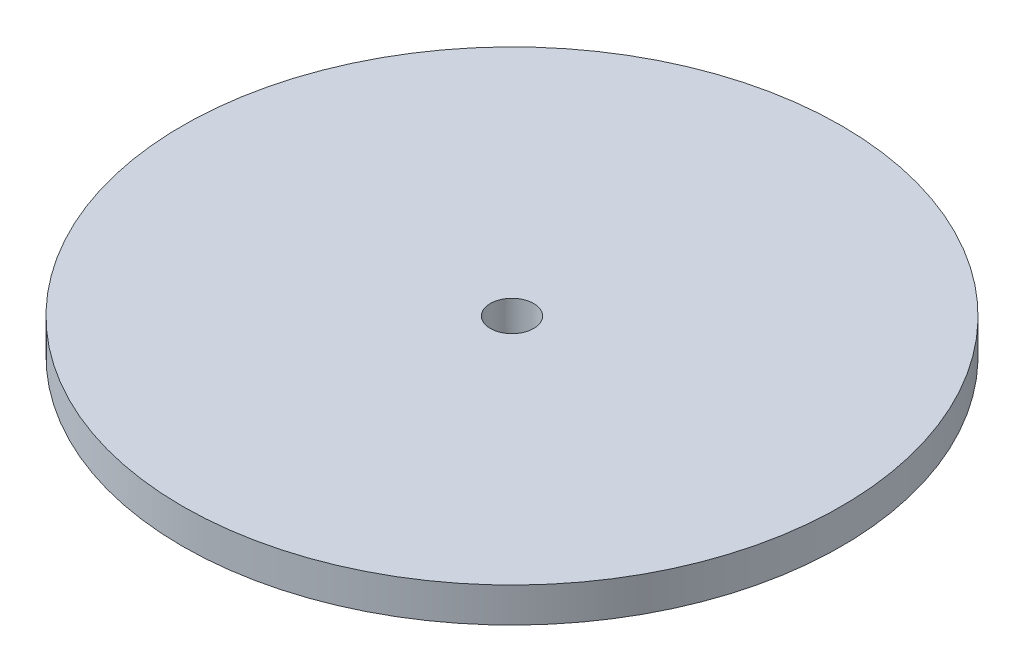
ISO-10303-21;
HEADER;
FILE_DESCRIPTION(('STEP AP214'),'2;1');
FILE_NAME('part.step','',(''),(''),'','','');
FILE_SCHEMA(('AUTOMOTIVE_DESIGN { 1 0 10303 214 1 1 1 1 }'));
ENDSEC;
DATA;
#1=APPLICATION_CONTEXT('core data for automotive mechanical design processes');
#2=APPLICATION_PROTOCOL_DEFINITION('international standard','automotive_design',2000,#1);
#3=PRODUCT_CONTEXT('',#1,'mechanical');
#4=PRODUCT('Part','Part','',(#3));
#5=PRODUCT_RELATED_PRODUCT_CATEGORY('part','',(#4));
#6=PRODUCT_DEFINITION_FORMATION('','',#4);
#7=PRODUCT_DEFINITION_CONTEXT('part definition',#1,'design');
#8=PRODUCT_DEFINITION('design','',#6,#7);
#9=PRODUCT_DEFINITION_SHAPE('','',#8);
#10=(LENGTH_UNIT() NAMED_UNIT(*) SI_UNIT(.MILLI.,.METRE.));
#11=(NAMED_UNIT(*) PLANE_ANGLE_UNIT() SI_UNIT($,.RADIAN.));
#12=(NAMED_UNIT(*) SI_UNIT($,.STERADIAN.) SOLID_ANGLE_UNIT());
#13=UNCERTAINTY_MEASURE_WITH_UNIT(LENGTH_MEASURE(1.E-05),#10,'distance_accuracy_value','');
#14=(GEOMETRIC_REPRESENTATION_CONTEXT(3) GLOBAL_UNCERTAINTY_ASSIGNED_CONTEXT((#13)) GLOBAL_UNIT_ASSIGNED_CONTEXT((#10,
#11,#12)) REPRESENTATION_CONTEXT('',''));
#15=CARTESIAN_POINT('',(0.,0.,0.));
#16=DIRECTION('',(0.,0.,1.));
#17=DIRECTION('',(1.,0.,0.));
#18=AXIS2_PLACEMENT_3D('',#15,#16,#17);
#19=CARTESIAN_POINT('',(0.,4.,0.));
#20=DIRECTION('',(0.,1.,0.));
#21=DIRECTION('',(0.,0.,1.));
#22=AXIS2_PLACEMENT_3D('',#19,#20,#21);
#23=PLANE('',#22);
#24=CARTESIAN_POINT('',(0.,4.,0.));
#25=DIRECTION('',(0.,1.,0.));
#26=DIRECTION('',(0.,0.,1.));
#27=AXIS2_PLACEMENT_3D('',#24,#25,#26);
#28=CIRCLE('',#27,38.);
#29=CARTESIAN_POINT('',(0.,4.,38.));
#30=VERTEX_POINT('',#29);
#31=EDGE_CURVE('E10',#30,#30,#28,.T.);
#32=ORIENTED_EDGE('',*,*,#31,.T.);
#33=EDGE_LOOP('',(#32));
#34=FACE_BOUND('',#33,.T.);
#35=CARTESIAN_POINT('',(0.,4.,0.));
#36=DIRECTION('',(0.,1.,0.));
#37=DIRECTION('',(0.,0.,1.));
#38=AXIS2_PLACEMENT_3D('',#35,#36,#37);
#39=CIRCLE('',#38,2.5);
#40=CARTESIAN_POINT('',(0.,4.,2.5));
#41=VERTEX_POINT('',#40);
#42=EDGE_CURVE('E43',#41,#41,#39,.T.);
#43=ORIENTED_EDGE('',*,*,#42,.F.);
#44=EDGE_LOOP('',(#43));
#45=FACE_BOUND('',#44,.T.);
#46=ADVANCED_FACE('F32',(#34,#45),#23,.T.);
#47=CARTESIAN_POINT('',(0.,0.,0.));
#48=DIRECTION('',(0.,1.,0.));
#49=DIRECTION('',(0.,0.,1.));
#50=AXIS2_PLACEMENT_3D('',#47,#48,#49);
#51=PLANE('',#50);
#52=CARTESIAN_POINT('',(0.,0.,0.));
#53=DIRECTION('',(0.,1.,0.));
#54=DIRECTION('',(0.,0.,1.));
#55=AXIS2_PLACEMENT_3D('',#52,#53,#54);
#56=CIRCLE('',#55,38.);
#57=CARTESIAN_POINT('',(0.,0.,38.));
#58=VERTEX_POINT('',#57);
#59=EDGE_CURVE('E36',#58,#58,#56,.T.);
#60=ORIENTED_EDGE('',*,*,#59,.F.);
#61=EDGE_LOOP('',(#60));
#62=FACE_BOUND('',#61,.T.);
#63=CARTESIAN_POINT('',(0.,0.,0.));
#64=DIRECTION('',(0.,1.,0.));
#65=DIRECTION('',(0.,0.,1.));
#66=AXIS2_PLACEMENT_3D('',#63,#64,#65);
#67=CIRCLE('',#66,2.5);
#68=CARTESIAN_POINT('',(0.,0.,2.5));
#69=VERTEX_POINT('',#68);
#70=EDGE_CURVE('E45',#69,#69,#67,.T.);
#71=ORIENTED_EDGE('',*,*,#70,.T.);
#72=EDGE_LOOP('',(#71));
#73=FACE_BOUND('',#72,.T.);
#74=ADVANCED_FACE('F55',(#62,#73),#51,.F.);
#75=CARTESIAN_POINT('',(0.,4.,0.));
#76=DIRECTION('',(0.,-1.,0.));
#77=DIRECTION('',(0.,0.,-1.));
#78=AXIS2_PLACEMENT_3D('',#75,#76,#77);
#79=CYLINDRICAL_SURFACE('',#78,38.);
#80=ORIENTED_EDGE('',*,*,#31,.F.);
#81=EDGE_LOOP('',(#80));
#82=FACE_BOUND('',#81,.T.);
#83=ORIENTED_EDGE('',*,*,#59,.T.);
#84=EDGE_LOOP('',(#83));
#85=FACE_BOUND('',#84,.T.);
#86=ADVANCED_FACE('F34',(#82,#85),#79,.T.);
#87=CARTESIAN_POINT('',(0.,4.,0.));
#88=DIRECTION('',(0.,-1.,0.));
#89=DIRECTION('',(0.,0.,-1.));
#90=AXIS2_PLACEMENT_3D('',#87,#88,#89);
#91=CYLINDRICAL_SURFACE('',#90,2.5);
#92=ORIENTED_EDGE('',*,*,#42,.T.);
#93=EDGE_LOOP('',(#92));
#94=FACE_BOUND('',#93,.T.);
#95=ORIENTED_EDGE('',*,*,#70,.F.);
#96=EDGE_LOOP('',(#95));
#97=FACE_BOUND('',#96,.T.);
#98=ADVANCED_FACE('F51',(#94,#97),#91,.F.);
#99=CLOSED_SHELL('',(#46,#74,#86,#98));
#100=MANIFOLD_SOLID_BREP('B2',#99);
#101=ADVANCED_BREP_SHAPE_REPRESENTATION('',(#18,#100),#14);
#102=SHAPE_DEFINITION_REPRESENTATION(#9,#101);
ENDSEC;
END-ISO-10303-21;
